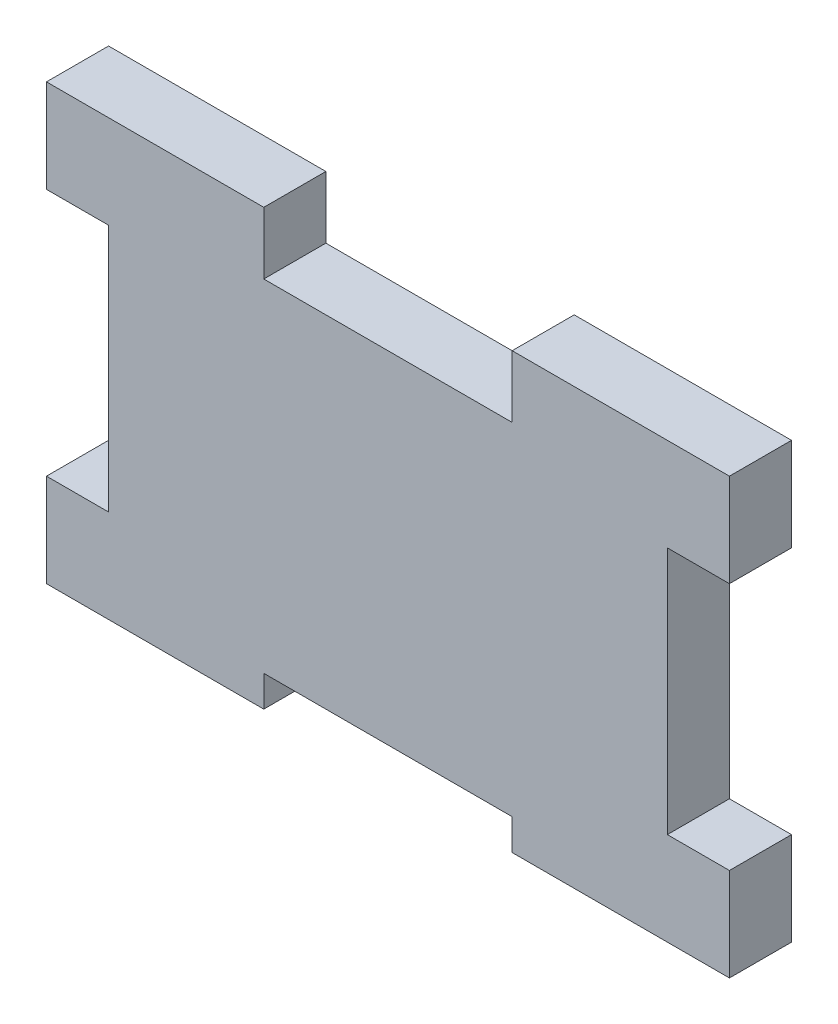
ISO-10303-21;
HEADER;
FILE_DESCRIPTION(('STEP AP214'),'2;1');
FILE_NAME('part.step','',(''),(''),'','','');
FILE_SCHEMA(('AUTOMOTIVE_DESIGN { 1 0 10303 214 1 1 1 1 }'));
ENDSEC;
DATA;
#1=APPLICATION_CONTEXT('core data for automotive mechanical design processes');
#2=APPLICATION_PROTOCOL_DEFINITION('international standard','automotive_design',2000,#1);
#3=PRODUCT_CONTEXT('',#1,'mechanical');
#4=PRODUCT('Part','Part','',(#3));
#5=PRODUCT_RELATED_PRODUCT_CATEGORY('part','',(#4));
#6=PRODUCT_DEFINITION_FORMATION('','',#4);
#7=PRODUCT_DEFINITION_CONTEXT('part definition',#1,'design');
#8=PRODUCT_DEFINITION('design','',#6,#7);
#9=PRODUCT_DEFINITION_SHAPE('','',#8);
#10=(LENGTH_UNIT() NAMED_UNIT(*) SI_UNIT(.MILLI.,.METRE.));
#11=(NAMED_UNIT(*) PLANE_ANGLE_UNIT() SI_UNIT($,.RADIAN.));
#12=(NAMED_UNIT(*) SI_UNIT($,.STERADIAN.) SOLID_ANGLE_UNIT());
#13=UNCERTAINTY_MEASURE_WITH_UNIT(LENGTH_MEASURE(1.E-05),#10,'distance_accuracy_value','');
#14=(GEOMETRIC_REPRESENTATION_CONTEXT(3) GLOBAL_UNCERTAINTY_ASSIGNED_CONTEXT((#13)) GLOBAL_UNIT_ASSIGNED_CONTEXT((#10,
#11,#12)) REPRESENTATION_CONTEXT('',''));
#15=CARTESIAN_POINT('',(0.,0.,0.));
#16=DIRECTION('',(0.,0.,1.));
#17=DIRECTION('',(1.,0.,0.));
#18=AXIS2_PLACEMENT_3D('',#15,#16,#17);
#19=CARTESIAN_POINT('',(25.,0.,10.));
#20=DIRECTION('',(1.,0.,0.));
#21=DIRECTION('',(0.,0.,-1.));
#22=AXIS2_PLACEMENT_3D('',#19,#20,#21);
#23=PLANE('',#22);
#24=DIRECTION('',(0.,-1.,0.));
#25=VECTOR('',#24,1.);
#26=CARTESIAN_POINT('',(25.,0.,0.));
#27=LINE('',#26,#25);
#28=CARTESIAN_POINT('',(25.,0.,0.));
#29=VERTEX_POINT('',#28);
#30=CARTESIAN_POINT('',(25.,-5.,0.));
#31=VERTEX_POINT('',#30);
#32=EDGE_CURVE('E243',#29,#31,#27,.T.);
#33=ORIENTED_EDGE('',*,*,#32,.F.);
#34=DIRECTION('',(0.,0.,-1.));
#35=VECTOR('',#34,1.);
#36=CARTESIAN_POINT('',(25.,0.,10.));
#37=LINE('',#36,#35);
#38=CARTESIAN_POINT('',(25.,0.,10.));
#39=VERTEX_POINT('',#38);
#40=EDGE_CURVE('E11',#39,#29,#37,.T.);
#41=ORIENTED_EDGE('',*,*,#40,.F.);
#42=DIRECTION('',(0.,-1.,0.));
#43=VECTOR('',#42,1.);
#44=CARTESIAN_POINT('',(25.,0.,10.));
#45=LINE('',#44,#43);
#46=CARTESIAN_POINT('',(25.,-5.,10.));
#47=VERTEX_POINT('',#46);
#48=EDGE_CURVE('E315',#39,#47,#45,.T.);
#49=ORIENTED_EDGE('',*,*,#48,.T.);
#50=DIRECTION('',(0.,0.,-1.));
#51=VECTOR('',#50,1.);
#52=CARTESIAN_POINT('',(25.,-5.,10.));
#53=LINE('',#52,#51);
#54=EDGE_CURVE('E58',#47,#31,#53,.T.);
#55=ORIENTED_EDGE('',*,*,#54,.T.);
#56=EDGE_LOOP('',(#33,#41,#49,#55));
#57=FACE_BOUND('',#56,.T.);
#58=ADVANCED_FACE('F41',(#57),#23,.T.);
#59=CARTESIAN_POINT('',(0.,0.,10.));
#60=DIRECTION('',(0.,1.,0.));
#61=DIRECTION('',(0.,0.,1.));
#62=AXIS2_PLACEMENT_3D('',#59,#60,#61);
#63=PLANE('',#62);
#64=DIRECTION('',(1.,0.,0.));
#65=VECTOR('',#64,1.);
#66=CARTESIAN_POINT('',(0.,0.,0.));
#67=LINE('',#66,#65);
#68=CARTESIAN_POINT('',(65.,0.,0.));
#69=VERTEX_POINT('',#68);
#70=EDGE_CURVE('E246',#29,#69,#67,.T.);
#71=ORIENTED_EDGE('',*,*,#70,.T.);
#72=DIRECTION('',(0.,0.,-1.));
#73=VECTOR('',#72,1.);
#74=CARTESIAN_POINT('',(65.,0.,10.));
#75=LINE('',#74,#73);
#76=CARTESIAN_POINT('',(65.,0.,10.));
#77=VERTEX_POINT('',#76);
#78=EDGE_CURVE('E50',#77,#69,#75,.T.);
#79=ORIENTED_EDGE('',*,*,#78,.F.);
#80=DIRECTION('',(1.,0.,0.));
#81=VECTOR('',#80,1.);
#82=CARTESIAN_POINT('',(0.,0.,10.));
#83=LINE('',#82,#81);
#84=EDGE_CURVE('E391',#39,#77,#83,.T.);
#85=ORIENTED_EDGE('',*,*,#84,.F.);
#86=ORIENTED_EDGE('',*,*,#40,.T.);
#87=EDGE_LOOP('',(#71,#79,#85,#86));
#88=FACE_BOUND('',#87,.T.);
#89=ADVANCED_FACE('F449',(#88),#63,.F.);
#90=CARTESIAN_POINT('',(65.,0.,10.));
#91=DIRECTION('',(1.,0.,0.));
#92=DIRECTION('',(0.,0.,-1.));
#93=AXIS2_PLACEMENT_3D('',#90,#91,#92);
#94=PLANE('',#93);
#95=DIRECTION('',(0.,-1.,0.));
#96=VECTOR('',#95,1.);
#97=CARTESIAN_POINT('',(65.,0.,0.));
#98=LINE('',#97,#96);
#99=CARTESIAN_POINT('',(65.,-5.,0.));
#100=VERTEX_POINT('',#99);
#101=EDGE_CURVE('E249',#69,#100,#98,.T.);
#102=ORIENTED_EDGE('',*,*,#101,.T.);
#103=DIRECTION('',(0.,0.,-1.));
#104=VECTOR('',#103,1.);
#105=CARTESIAN_POINT('',(65.,-5.,10.));
#106=LINE('',#105,#104);
#107=CARTESIAN_POINT('',(65.,-5.,10.));
#108=VERTEX_POINT('',#107);
#109=EDGE_CURVE('E360',#108,#100,#106,.T.);
#110=ORIENTED_EDGE('',*,*,#109,.F.);
#111=DIRECTION('',(0.,-1.,0.));
#112=VECTOR('',#111,1.);
#113=CARTESIAN_POINT('',(65.,0.,10.));
#114=LINE('',#113,#112);
#115=EDGE_CURVE('E370',#77,#108,#114,.T.);
#116=ORIENTED_EDGE('',*,*,#115,.F.);
#117=ORIENTED_EDGE('',*,*,#78,.T.);
#118=EDGE_LOOP('',(#102,#110,#116,#117));
#119=FACE_BOUND('',#118,.T.);
#120=ADVANCED_FACE('F368',(#119),#94,.F.);
#121=CARTESIAN_POINT('',(0.,-5.,10.));
#122=DIRECTION('',(0.,-1.,0.));
#123=DIRECTION('',(0.,0.,-1.));
#124=AXIS2_PLACEMENT_3D('',#121,#122,#123);
#125=PLANE('',#124);
#126=DIRECTION('',(-1.,0.,0.));
#127=VECTOR('',#126,1.);
#128=CARTESIAN_POINT('',(0.,-5.,0.));
#129=LINE('',#128,#127);
#130=CARTESIAN_POINT('',(100.,-5.,0.));
#131=VERTEX_POINT('',#130);
#132=EDGE_CURVE('E253',#131,#100,#129,.T.);
#133=ORIENTED_EDGE('',*,*,#132,.F.);
#134=DIRECTION('',(0.,0.,-1.));
#135=VECTOR('',#134,1.);
#136=CARTESIAN_POINT('',(100.,-5.,10.));
#137=LINE('',#136,#135);
#138=CARTESIAN_POINT('',(100.,-5.,10.));
#139=VERTEX_POINT('',#138);
#140=EDGE_CURVE('E357',#139,#131,#137,.T.);
#141=ORIENTED_EDGE('',*,*,#140,.F.);
#142=DIRECTION('',(-1.,0.,0.));
#143=VECTOR('',#142,1.);
#144=CARTESIAN_POINT('',(0.,-5.,10.));
#145=LINE('',#144,#143);
#146=EDGE_CURVE('E381',#139,#108,#145,.T.);
#147=ORIENTED_EDGE('',*,*,#146,.T.);
#148=ORIENTED_EDGE('',*,*,#109,.T.);
#149=EDGE_LOOP('',(#133,#141,#147,#148));
#150=FACE_BOUND('',#149,.T.);
#151=ADVANCED_FACE('F378',(#150),#125,.T.);
#152=CARTESIAN_POINT('',(100.,0.,10.));
#153=DIRECTION('',(1.,0.,0.));
#154=DIRECTION('',(0.,0.,-1.));
#155=AXIS2_PLACEMENT_3D('',#152,#153,#154);
#156=PLANE('',#155);
#157=DIRECTION('',(0.,-1.,0.));
#158=VECTOR('',#157,1.);
#159=CARTESIAN_POINT('',(100.,0.,0.));
#160=LINE('',#159,#158);
#161=CARTESIAN_POINT('',(100.,10.,0.));
#162=VERTEX_POINT('',#161);
#163=EDGE_CURVE('E257',#162,#131,#160,.T.);
#164=ORIENTED_EDGE('',*,*,#163,.F.);
#165=DIRECTION('',(0.,0.,-1.));
#166=VECTOR('',#165,1.);
#167=CARTESIAN_POINT('',(100.,10.,10.));
#168=LINE('',#167,#166);
#169=CARTESIAN_POINT('',(100.,10.,10.));
#170=VERTEX_POINT('',#169);
#171=EDGE_CURVE('E354',#170,#162,#168,.T.);
#172=ORIENTED_EDGE('',*,*,#171,.F.);
#173=DIRECTION('',(0.,-1.,0.));
#174=VECTOR('',#173,1.);
#175=CARTESIAN_POINT('',(100.,0.,10.));
#176=LINE('',#175,#174);
#177=EDGE_CURVE('E385',#170,#139,#176,.T.);
#178=ORIENTED_EDGE('',*,*,#177,.T.);
#179=ORIENTED_EDGE('',*,*,#140,.T.);
#180=EDGE_LOOP('',(#164,#172,#178,#179));
#181=FACE_BOUND('',#180,.T.);
#182=ADVANCED_FACE('F460',(#181),#156,.T.);
#183=CARTESIAN_POINT('',(0.,10.,10.));
#184=DIRECTION('',(0.,1.,0.));
#185=DIRECTION('',(0.,0.,1.));
#186=AXIS2_PLACEMENT_3D('',#183,#184,#185);
#187=PLANE('',#186);
#188=DIRECTION('',(1.,0.,0.));
#189=VECTOR('',#188,1.);
#190=CARTESIAN_POINT('',(0.,10.,0.));
#191=LINE('',#190,#189);
#192=CARTESIAN_POINT('',(90.,10.,0.));
#193=VERTEX_POINT('',#192);
#194=EDGE_CURVE('E261',#193,#162,#191,.T.);
#195=ORIENTED_EDGE('',*,*,#194,.F.);
#196=DIRECTION('',(0.,0.,-1.));
#197=VECTOR('',#196,1.);
#198=CARTESIAN_POINT('',(90.,10.,10.));
#199=LINE('',#198,#197);
#200=CARTESIAN_POINT('',(90.,10.,10.));
#201=VERTEX_POINT('',#200);
#202=EDGE_CURVE('E351',#201,#193,#199,.T.);
#203=ORIENTED_EDGE('',*,*,#202,.F.);
#204=DIRECTION('',(1.,0.,0.));
#205=VECTOR('',#204,1.);
#206=CARTESIAN_POINT('',(0.,10.,10.));
#207=LINE('',#206,#205);
#208=EDGE_CURVE('E388',#201,#170,#207,.T.);
#209=ORIENTED_EDGE('',*,*,#208,.T.);
#210=ORIENTED_EDGE('',*,*,#171,.T.);
#211=EDGE_LOOP('',(#195,#203,#209,#210));
#212=FACE_BOUND('',#211,.T.);
#213=ADVANCED_FACE('F463',(#212),#187,.T.);
#214=CARTESIAN_POINT('',(90.,0.,10.));
#215=DIRECTION('',(-1.,0.,0.));
#216=DIRECTION('',(0.,0.,1.));
#217=AXIS2_PLACEMENT_3D('',#214,#215,#216);
#218=PLANE('',#217);
#219=DIRECTION('',(0.,1.,0.));
#220=VECTOR('',#219,1.);
#221=CARTESIAN_POINT('',(90.,0.,0.));
#222=LINE('',#221,#220);
#223=CARTESIAN_POINT('',(90.,50.,0.));
#224=VERTEX_POINT('',#223);
#225=EDGE_CURVE('E265',#193,#224,#222,.T.);
#226=ORIENTED_EDGE('',*,*,#225,.T.);
#227=DIRECTION('',(0.,0.,-1.));
#228=VECTOR('',#227,1.);
#229=CARTESIAN_POINT('',(90.,50.,10.));
#230=LINE('',#229,#228);
#231=CARTESIAN_POINT('',(90.,50.,10.));
#232=VERTEX_POINT('',#231);
#233=EDGE_CURVE('E348',#232,#224,#230,.T.);
#234=ORIENTED_EDGE('',*,*,#233,.F.);
#235=DIRECTION('',(0.,1.,0.));
#236=VECTOR('',#235,1.);
#237=CARTESIAN_POINT('',(90.,0.,10.));
#238=LINE('',#237,#236);
#239=EDGE_CURVE('E398',#201,#232,#238,.T.);
#240=ORIENTED_EDGE('',*,*,#239,.F.);
#241=ORIENTED_EDGE('',*,*,#202,.T.);
#242=EDGE_LOOP('',(#226,#234,#240,#241));
#243=FACE_BOUND('',#242,.T.);
#244=ADVANCED_FACE('F467',(#243),#218,.F.);
#245=CARTESIAN_POINT('',(0.,50.,10.));
#246=DIRECTION('',(0.,1.,0.));
#247=DIRECTION('',(0.,0.,1.));
#248=AXIS2_PLACEMENT_3D('',#245,#246,#247);
#249=PLANE('',#248);
#250=DIRECTION('',(1.,0.,0.));
#251=VECTOR('',#250,1.);
#252=CARTESIAN_POINT('',(0.,50.,0.));
#253=LINE('',#252,#251);
#254=CARTESIAN_POINT('',(100.,50.,0.));
#255=VERTEX_POINT('',#254);
#256=EDGE_CURVE('E268',#224,#255,#253,.T.);
#257=ORIENTED_EDGE('',*,*,#256,.T.);
#258=DIRECTION('',(0.,0.,-1.));
#259=VECTOR('',#258,1.);
#260=CARTESIAN_POINT('',(100.,50.,10.));
#261=LINE('',#260,#259);
#262=CARTESIAN_POINT('',(100.,50.,10.));
#263=VERTEX_POINT('',#262);
#264=EDGE_CURVE('E346',#263,#255,#261,.T.);
#265=ORIENTED_EDGE('',*,*,#264,.F.);
#266=DIRECTION('',(1.,0.,0.));
#267=VECTOR('',#266,1.);
#268=CARTESIAN_POINT('',(0.,50.,10.));
#269=LINE('',#268,#267);
#270=EDGE_CURVE('E401',#232,#263,#269,.T.);
#271=ORIENTED_EDGE('',*,*,#270,.F.);
#272=ORIENTED_EDGE('',*,*,#233,.T.);
#273=EDGE_LOOP('',(#257,#265,#271,#272));
#274=FACE_BOUND('',#273,.T.);
#275=ADVANCED_FACE('F471',(#274),#249,.F.);
#276=CARTESIAN_POINT('',(99.9999999999999,0.,10.));
#277=DIRECTION('',(1.,0.,0.));
#278=DIRECTION('',(0.,1.,0.));
#279=AXIS2_PLACEMENT_3D('',#276,#277,#278);
#280=PLANE('',#279);
#281=DIRECTION('',(0.,-1.,0.));
#282=VECTOR('',#281,1.);
#283=CARTESIAN_POINT('',(99.9999999999999,0.,0.));
#284=LINE('',#283,#282);
#285=CARTESIAN_POINT('',(100.,65.,0.));
#286=VERTEX_POINT('',#285);
#287=EDGE_CURVE('E271',#286,#255,#284,.T.);
#288=ORIENTED_EDGE('',*,*,#287,.F.);
#289=DIRECTION('',(0.,0.,-1.));
#290=VECTOR('',#289,1.);
#291=CARTESIAN_POINT('',(100.,65.,10.));
#292=LINE('',#291,#290);
#293=CARTESIAN_POINT('',(100.,65.,10.));
#294=VERTEX_POINT('',#293);
#295=EDGE_CURVE('E343',#294,#286,#292,.T.);
#296=ORIENTED_EDGE('',*,*,#295,.F.);
#297=DIRECTION('',(0.,-1.,0.));
#298=VECTOR('',#297,1.);
#299=CARTESIAN_POINT('',(99.9999999999999,0.,10.));
#300=LINE('',#299,#298);
#301=EDGE_CURVE('E403',#294,#263,#300,.T.);
#302=ORIENTED_EDGE('',*,*,#301,.T.);
#303=ORIENTED_EDGE('',*,*,#264,.T.);
#304=EDGE_LOOP('',(#288,#296,#302,#303));
#305=FACE_BOUND('',#304,.T.);
#306=ADVANCED_FACE('F475',(#305),#280,.T.);
#307=CARTESIAN_POINT('',(0.,65.,10.));
#308=DIRECTION('',(0.,1.,0.));
#309=DIRECTION('',(0.,0.,1.));
#310=AXIS2_PLACEMENT_3D('',#307,#308,#309);
#311=PLANE('',#310);
#312=DIRECTION('',(1.,0.,0.));
#313=VECTOR('',#312,1.);
#314=CARTESIAN_POINT('',(0.,65.,0.));
#315=LINE('',#314,#313);
#316=CARTESIAN_POINT('',(65.,65.,0.));
#317=VERTEX_POINT('',#316);
#318=EDGE_CURVE('E275',#317,#286,#315,.T.);
#319=ORIENTED_EDGE('',*,*,#318,.F.);
#320=DIRECTION('',(0.,0.,-1.));
#321=VECTOR('',#320,1.);
#322=CARTESIAN_POINT('',(65.,65.,10.));
#323=LINE('',#322,#321);
#324=CARTESIAN_POINT('',(65.,65.,10.));
#325=VERTEX_POINT('',#324);
#326=EDGE_CURVE('E340',#325,#317,#323,.T.);
#327=ORIENTED_EDGE('',*,*,#326,.F.);
#328=DIRECTION('',(1.,0.,0.));
#329=VECTOR('',#328,1.);
#330=CARTESIAN_POINT('',(0.,65.,10.));
#331=LINE('',#330,#329);
#332=EDGE_CURVE('E407',#325,#294,#331,.T.);
#333=ORIENTED_EDGE('',*,*,#332,.T.);
#334=ORIENTED_EDGE('',*,*,#295,.T.);
#335=EDGE_LOOP('',(#319,#327,#333,#334));
#336=FACE_BOUND('',#335,.T.);
#337=ADVANCED_FACE('F479',(#336),#311,.T.);
#338=CARTESIAN_POINT('',(65.,0.,10.));
#339=DIRECTION('',(-1.,0.,0.));
#340=DIRECTION('',(0.,0.,1.));
#341=AXIS2_PLACEMENT_3D('',#338,#339,#340);
#342=PLANE('',#341);
#343=DIRECTION('',(0.,1.,0.));
#344=VECTOR('',#343,1.);
#345=CARTESIAN_POINT('',(65.,0.,0.));
#346=LINE('',#345,#344);
#347=CARTESIAN_POINT('',(65.,55.,0.));
#348=VERTEX_POINT('',#347);
#349=EDGE_CURVE('E279',#348,#317,#346,.T.);
#350=ORIENTED_EDGE('',*,*,#349,.F.);
#351=DIRECTION('',(0.,0.,-1.));
#352=VECTOR('',#351,1.);
#353=CARTESIAN_POINT('',(65.,55.,10.));
#354=LINE('',#353,#352);
#355=CARTESIAN_POINT('',(65.,55.,10.));
#356=VERTEX_POINT('',#355);
#357=EDGE_CURVE('E337',#356,#348,#354,.T.);
#358=ORIENTED_EDGE('',*,*,#357,.F.);
#359=DIRECTION('',(0.,1.,0.));
#360=VECTOR('',#359,1.);
#361=CARTESIAN_POINT('',(65.,0.,10.));
#362=LINE('',#361,#360);
#363=EDGE_CURVE('E411',#356,#325,#362,.T.);
#364=ORIENTED_EDGE('',*,*,#363,.T.);
#365=ORIENTED_EDGE('',*,*,#326,.T.);
#366=EDGE_LOOP('',(#350,#358,#364,#365));
#367=FACE_BOUND('',#366,.T.);
#368=ADVANCED_FACE('F483',(#367),#342,.T.);
#369=CARTESIAN_POINT('',(0.,55.,10.));
#370=DIRECTION('',(0.,1.,0.));
#371=DIRECTION('',(0.,0.,1.));
#372=AXIS2_PLACEMENT_3D('',#369,#370,#371);
#373=PLANE('',#372);
#374=DIRECTION('',(1.,0.,0.));
#375=VECTOR('',#374,1.);
#376=CARTESIAN_POINT('',(0.,55.,0.));
#377=LINE('',#376,#375);
#378=CARTESIAN_POINT('',(25.,55.,0.));
#379=VERTEX_POINT('',#378);
#380=EDGE_CURVE('E283',#379,#348,#377,.T.);
#381=ORIENTED_EDGE('',*,*,#380,.F.);
#382=DIRECTION('',(0.,0.,-1.));
#383=VECTOR('',#382,1.);
#384=CARTESIAN_POINT('',(25.,55.,10.));
#385=LINE('',#384,#383);
#386=CARTESIAN_POINT('',(25.,55.,10.));
#387=VERTEX_POINT('',#386);
#388=EDGE_CURVE('E334',#387,#379,#385,.T.);
#389=ORIENTED_EDGE('',*,*,#388,.F.);
#390=DIRECTION('',(1.,0.,0.));
#391=VECTOR('',#390,1.);
#392=CARTESIAN_POINT('',(0.,55.,10.));
#393=LINE('',#392,#391);
#394=EDGE_CURVE('E415',#387,#356,#393,.T.);
#395=ORIENTED_EDGE('',*,*,#394,.T.);
#396=ORIENTED_EDGE('',*,*,#357,.T.);
#397=EDGE_LOOP('',(#381,#389,#395,#396));
#398=FACE_BOUND('',#397,.T.);
#399=ADVANCED_FACE('F487',(#398),#373,.T.);
#400=CARTESIAN_POINT('',(25.,0.,10.));
#401=DIRECTION('',(-1.,0.,0.));
#402=DIRECTION('',(0.,0.,1.));
#403=AXIS2_PLACEMENT_3D('',#400,#401,#402);
#404=PLANE('',#403);
#405=DIRECTION('',(0.,1.,0.));
#406=VECTOR('',#405,1.);
#407=CARTESIAN_POINT('',(25.,0.,0.));
#408=LINE('',#407,#406);
#409=CARTESIAN_POINT('',(25.,65.,0.));
#410=VERTEX_POINT('',#409);
#411=EDGE_CURVE('E287',#379,#410,#408,.T.);
#412=ORIENTED_EDGE('',*,*,#411,.T.);
#413=DIRECTION('',(0.,0.,-1.));
#414=VECTOR('',#413,1.);
#415=CARTESIAN_POINT('',(25.,65.,10.));
#416=LINE('',#415,#414);
#417=CARTESIAN_POINT('',(25.,65.,10.));
#418=VERTEX_POINT('',#417);
#419=EDGE_CURVE('E331',#418,#410,#416,.T.);
#420=ORIENTED_EDGE('',*,*,#419,.F.);
#421=DIRECTION('',(0.,1.,0.));
#422=VECTOR('',#421,1.);
#423=CARTESIAN_POINT('',(25.,0.,10.));
#424=LINE('',#423,#422);
#425=EDGE_CURVE('E419',#387,#418,#424,.T.);
#426=ORIENTED_EDGE('',*,*,#425,.F.);
#427=ORIENTED_EDGE('',*,*,#388,.T.);
#428=EDGE_LOOP('',(#412,#420,#426,#427));
#429=FACE_BOUND('',#428,.T.);
#430=ADVANCED_FACE('F491',(#429),#404,.F.);
#431=CARTESIAN_POINT('',(0.,65.,10.));
#432=DIRECTION('',(0.,1.,0.));
#433=DIRECTION('',(0.,0.,1.));
#434=AXIS2_PLACEMENT_3D('',#431,#432,#433);
#435=PLANE('',#434);
#436=DIRECTION('',(1.,0.,0.));
#437=VECTOR('',#436,1.);
#438=CARTESIAN_POINT('',(0.,65.,0.));
#439=LINE('',#438,#437);
#440=CARTESIAN_POINT('',(-10.,65.,0.));
#441=VERTEX_POINT('',#440);
#442=EDGE_CURVE('E291',#441,#410,#439,.T.);
#443=ORIENTED_EDGE('',*,*,#442,.F.);
#444=DIRECTION('',(0.,0.,-1.));
#445=VECTOR('',#444,1.);
#446=CARTESIAN_POINT('',(-10.,65.,10.));
#447=LINE('',#446,#445);
#448=CARTESIAN_POINT('',(-10.,65.,10.));
#449=VERTEX_POINT('',#448);
#450=EDGE_CURVE('E328',#449,#441,#447,.T.);
#451=ORIENTED_EDGE('',*,*,#450,.F.);
#452=DIRECTION('',(1.,0.,0.));
#453=VECTOR('',#452,1.);
#454=CARTESIAN_POINT('',(0.,65.,10.));
#455=LINE('',#454,#453);
#456=EDGE_CURVE('E422',#449,#418,#455,.T.);
#457=ORIENTED_EDGE('',*,*,#456,.T.);
#458=ORIENTED_EDGE('',*,*,#419,.T.);
#459=EDGE_LOOP('',(#443,#451,#457,#458));
#460=FACE_BOUND('',#459,.T.);
#461=ADVANCED_FACE('F495',(#460),#435,.T.);
#462=CARTESIAN_POINT('',(-10.,0.,10.));
#463=DIRECTION('',(-1.,0.,0.));
#464=DIRECTION('',(0.,0.,1.));
#465=AXIS2_PLACEMENT_3D('',#462,#463,#464);
#466=PLANE('',#465);
#467=DIRECTION('',(0.,1.,0.));
#468=VECTOR('',#467,1.);
#469=CARTESIAN_POINT('',(-10.,0.,0.));
#470=LINE('',#469,#468);
#471=CARTESIAN_POINT('',(-10.,50.,0.));
#472=VERTEX_POINT('',#471);
#473=EDGE_CURVE('E295',#472,#441,#470,.T.);
#474=ORIENTED_EDGE('',*,*,#473,.F.);
#475=DIRECTION('',(0.,0.,-1.));
#476=VECTOR('',#475,1.);
#477=CARTESIAN_POINT('',(-10.,50.,10.));
#478=LINE('',#477,#476);
#479=CARTESIAN_POINT('',(-10.,50.,10.));
#480=VERTEX_POINT('',#479);
#481=EDGE_CURVE('E325',#480,#472,#478,.T.);
#482=ORIENTED_EDGE('',*,*,#481,.F.);
#483=DIRECTION('',(0.,1.,0.));
#484=VECTOR('',#483,1.);
#485=CARTESIAN_POINT('',(-10.,0.,10.));
#486=LINE('',#485,#484);
#487=EDGE_CURVE('E426',#480,#449,#486,.T.);
#488=ORIENTED_EDGE('',*,*,#487,.T.);
#489=ORIENTED_EDGE('',*,*,#450,.T.);
#490=EDGE_LOOP('',(#474,#482,#488,#489));
#491=FACE_BOUND('',#490,.T.);
#492=ADVANCED_FACE('F499',(#491),#466,.T.);
#493=CARTESIAN_POINT('',(0.,50.,10.));
#494=DIRECTION('',(0.,-1.,0.));
#495=DIRECTION('',(0.,0.,-1.));
#496=AXIS2_PLACEMENT_3D('',#493,#494,#495);
#497=PLANE('',#496);
#498=DIRECTION('',(-1.,0.,0.));
#499=VECTOR('',#498,1.);
#500=CARTESIAN_POINT('',(0.,50.,0.));
#501=LINE('',#500,#499);
#502=CARTESIAN_POINT('',(0.,50.,0.));
#503=VERTEX_POINT('',#502);
#504=EDGE_CURVE('E299',#503,#472,#501,.T.);
#505=ORIENTED_EDGE('',*,*,#504,.F.);
#506=DIRECTION('',(0.,0.,-1.));
#507=VECTOR('',#506,1.);
#508=CARTESIAN_POINT('',(0.,50.,10.));
#509=LINE('',#508,#507);
#510=CARTESIAN_POINT('',(0.,50.,10.));
#511=VERTEX_POINT('',#510);
#512=EDGE_CURVE('E322',#511,#503,#509,.T.);
#513=ORIENTED_EDGE('',*,*,#512,.F.);
#514=DIRECTION('',(-1.,0.,0.));
#515=VECTOR('',#514,1.);
#516=CARTESIAN_POINT('',(0.,50.,10.));
#517=LINE('',#516,#515);
#518=EDGE_CURVE('E430',#511,#480,#517,.T.);
#519=ORIENTED_EDGE('',*,*,#518,.T.);
#520=ORIENTED_EDGE('',*,*,#481,.T.);
#521=EDGE_LOOP('',(#505,#513,#519,#520));
#522=FACE_BOUND('',#521,.T.);
#523=ADVANCED_FACE('F503',(#522),#497,.T.);
#524=CARTESIAN_POINT('',(0.,0.,10.));
#525=DIRECTION('',(-1.,0.,0.));
#526=DIRECTION('',(0.,0.,1.));
#527=AXIS2_PLACEMENT_3D('',#524,#525,#526);
#528=PLANE('',#527);
#529=DIRECTION('',(0.,1.,0.));
#530=VECTOR('',#529,1.);
#531=CARTESIAN_POINT('',(0.,0.,0.));
#532=LINE('',#531,#530);
#533=CARTESIAN_POINT('',(0.,10.,0.));
#534=VERTEX_POINT('',#533);
#535=EDGE_CURVE('E303',#534,#503,#532,.T.);
#536=ORIENTED_EDGE('',*,*,#535,.F.);
#537=DIRECTION('',(0.,0.,-1.));
#538=VECTOR('',#537,1.);
#539=CARTESIAN_POINT('',(0.,10.,10.));
#540=LINE('',#539,#538);
#541=CARTESIAN_POINT('',(0.,10.,10.));
#542=VERTEX_POINT('',#541);
#543=EDGE_CURVE('E232',#542,#534,#540,.T.);
#544=ORIENTED_EDGE('',*,*,#543,.F.);
#545=DIRECTION('',(0.,1.,0.));
#546=VECTOR('',#545,1.);
#547=CARTESIAN_POINT('',(0.,0.,10.));
#548=LINE('',#547,#546);
#549=EDGE_CURVE('E220',#542,#511,#548,.T.);
#550=ORIENTED_EDGE('',*,*,#549,.T.);
#551=ORIENTED_EDGE('',*,*,#512,.T.);
#552=EDGE_LOOP('',(#536,#544,#550,#551));
#553=FACE_BOUND('',#552,.T.);
#554=ADVANCED_FACE('F436',(#553),#528,.T.);
#555=CARTESIAN_POINT('',(0.,10.,10.));
#556=DIRECTION('',(0.,-1.,0.));
#557=DIRECTION('',(0.,0.,-1.));
#558=AXIS2_PLACEMENT_3D('',#555,#556,#557);
#559=PLANE('',#558);
#560=DIRECTION('',(-1.,0.,0.));
#561=VECTOR('',#560,1.);
#562=CARTESIAN_POINT('',(0.,10.,0.));
#563=LINE('',#562,#561);
#564=CARTESIAN_POINT('',(-9.99999999999999,10.,0.));
#565=VERTEX_POINT('',#564);
#566=EDGE_CURVE('E228',#534,#565,#563,.T.);
#567=ORIENTED_EDGE('',*,*,#566,.T.);
#568=DIRECTION('',(0.,0.,-1.));
#569=VECTOR('',#568,1.);
#570=CARTESIAN_POINT('',(-9.99999999999999,10.,10.));
#571=LINE('',#570,#569);
#572=CARTESIAN_POINT('',(-9.99999999999999,10.,10.));
#573=VERTEX_POINT('',#572);
#574=EDGE_CURVE('E225',#573,#565,#571,.T.);
#575=ORIENTED_EDGE('',*,*,#574,.F.);
#576=DIRECTION('',(-1.,0.,0.));
#577=VECTOR('',#576,1.);
#578=CARTESIAN_POINT('',(0.,10.,10.));
#579=LINE('',#578,#577);
#580=EDGE_CURVE('E211',#542,#573,#579,.T.);
#581=ORIENTED_EDGE('',*,*,#580,.F.);
#582=ORIENTED_EDGE('',*,*,#543,.T.);
#583=EDGE_LOOP('',(#567,#575,#581,#582));
#584=FACE_BOUND('',#583,.T.);
#585=ADVANCED_FACE('F226',(#584),#559,.F.);
#586=CARTESIAN_POINT('',(-10.,0.,10.));
#587=DIRECTION('',(-1.,0.,0.));
#588=DIRECTION('',(0.,-1.,0.));
#589=AXIS2_PLACEMENT_3D('',#586,#587,#588);
#590=PLANE('',#589);
#591=DIRECTION('',(0.,1.,0.));
#592=VECTOR('',#591,1.);
#593=CARTESIAN_POINT('',(-10.,0.,0.));
#594=LINE('',#593,#592);
#595=CARTESIAN_POINT('',(-10.,-5.,0.));
#596=VERTEX_POINT('',#595);
#597=EDGE_CURVE('E308',#596,#565,#594,.T.);
#598=ORIENTED_EDGE('',*,*,#597,.F.);
#599=DIRECTION('',(0.,0.,-1.));
#600=VECTOR('',#599,1.);
#601=CARTESIAN_POINT('',(-10.,-5.,10.));
#602=LINE('',#601,#600);
#603=CARTESIAN_POINT('',(-10.,-5.,10.));
#604=VERTEX_POINT('',#603);
#605=EDGE_CURVE('E135',#604,#596,#602,.T.);
#606=ORIENTED_EDGE('',*,*,#605,.F.);
#607=DIRECTION('',(0.,1.,0.));
#608=VECTOR('',#607,1.);
#609=CARTESIAN_POINT('',(-10.,0.,10.));
#610=LINE('',#609,#608);
#611=EDGE_CURVE('E217',#604,#573,#610,.T.);
#612=ORIENTED_EDGE('',*,*,#611,.T.);
#613=ORIENTED_EDGE('',*,*,#574,.T.);
#614=EDGE_LOOP('',(#598,#606,#612,#613));
#615=FACE_BOUND('',#614,.T.);
#616=ADVANCED_FACE('F234',(#615),#590,.T.);
#617=CARTESIAN_POINT('',(0.,-5.,10.));
#618=DIRECTION('',(0.,-1.,0.));
#619=DIRECTION('',(0.,0.,-1.));
#620=AXIS2_PLACEMENT_3D('',#617,#618,#619);
#621=PLANE('',#620);
#622=DIRECTION('',(-1.,0.,0.));
#623=VECTOR('',#622,1.);
#624=CARTESIAN_POINT('',(0.,-5.,0.));
#625=LINE('',#624,#623);
#626=EDGE_CURVE('E311',#31,#596,#625,.T.);
#627=ORIENTED_EDGE('',*,*,#626,.F.);
#628=ORIENTED_EDGE('',*,*,#54,.F.);
#629=DIRECTION('',(-1.,0.,0.));
#630=VECTOR('',#629,1.);
#631=CARTESIAN_POINT('',(0.,-5.,10.));
#632=LINE('',#631,#630);
#633=EDGE_CURVE('E236',#47,#604,#632,.T.);
#634=ORIENTED_EDGE('',*,*,#633,.T.);
#635=ORIENTED_EDGE('',*,*,#605,.T.);
#636=EDGE_LOOP('',(#627,#628,#634,#635));
#637=FACE_BOUND('',#636,.T.);
#638=ADVANCED_FACE('F438',(#637),#621,.T.);
#639=CARTESIAN_POINT('',(0.,0.,10.));
#640=DIRECTION('',(0.,0.,1.));
#641=DIRECTION('',(1.,0.,0.));
#642=AXIS2_PLACEMENT_3D('',#639,#640,#641);
#643=PLANE('',#642);
#644=ORIENTED_EDGE('',*,*,#48,.F.);
#645=ORIENTED_EDGE('',*,*,#84,.T.);
#646=ORIENTED_EDGE('',*,*,#115,.T.);
#647=ORIENTED_EDGE('',*,*,#146,.F.);
#648=ORIENTED_EDGE('',*,*,#177,.F.);
#649=ORIENTED_EDGE('',*,*,#208,.F.);
#650=ORIENTED_EDGE('',*,*,#239,.T.);
#651=ORIENTED_EDGE('',*,*,#270,.T.);
#652=ORIENTED_EDGE('',*,*,#301,.F.);
#653=ORIENTED_EDGE('',*,*,#332,.F.);
#654=ORIENTED_EDGE('',*,*,#363,.F.);
#655=ORIENTED_EDGE('',*,*,#394,.F.);
#656=ORIENTED_EDGE('',*,*,#425,.T.);
#657=ORIENTED_EDGE('',*,*,#456,.F.);
#658=ORIENTED_EDGE('',*,*,#487,.F.);
#659=ORIENTED_EDGE('',*,*,#518,.F.);
#660=ORIENTED_EDGE('',*,*,#549,.F.);
#661=ORIENTED_EDGE('',*,*,#580,.T.);
#662=ORIENTED_EDGE('',*,*,#611,.F.);
#663=ORIENTED_EDGE('',*,*,#633,.F.);
#664=EDGE_LOOP('',(#644,#645,#646,#647,#648,#649,#650,#651,#652,#653,#654,#655,#656,#657,#658,
#659,#660,#661,#662,#663));
#665=FACE_BOUND('',#664,.T.);
#666=ADVANCED_FACE('F214',(#665),#643,.T.);
#667=CARTESIAN_POINT('',(0.,0.,0.));
#668=DIRECTION('',(0.,0.,1.));
#669=DIRECTION('',(1.,0.,0.));
#670=AXIS2_PLACEMENT_3D('',#667,#668,#669);
#671=PLANE('',#670);
#672=ORIENTED_EDGE('',*,*,#32,.T.);
#673=ORIENTED_EDGE('',*,*,#626,.T.);
#674=ORIENTED_EDGE('',*,*,#597,.T.);
#675=ORIENTED_EDGE('',*,*,#566,.F.);
#676=ORIENTED_EDGE('',*,*,#535,.T.);
#677=ORIENTED_EDGE('',*,*,#504,.T.);
#678=ORIENTED_EDGE('',*,*,#473,.T.);
#679=ORIENTED_EDGE('',*,*,#442,.T.);
#680=ORIENTED_EDGE('',*,*,#411,.F.);
#681=ORIENTED_EDGE('',*,*,#380,.T.);
#682=ORIENTED_EDGE('',*,*,#349,.T.);
#683=ORIENTED_EDGE('',*,*,#318,.T.);
#684=ORIENTED_EDGE('',*,*,#287,.T.);
#685=ORIENTED_EDGE('',*,*,#256,.F.);
#686=ORIENTED_EDGE('',*,*,#225,.F.);
#687=ORIENTED_EDGE('',*,*,#194,.T.);
#688=ORIENTED_EDGE('',*,*,#163,.T.);
#689=ORIENTED_EDGE('',*,*,#132,.T.);
#690=ORIENTED_EDGE('',*,*,#101,.F.);
#691=ORIENTED_EDGE('',*,*,#70,.F.);
#692=EDGE_LOOP('',(#672,#673,#674,#675,#676,#677,#678,#679,#680,#681,#682,#683,#684,#685,#686,
#687,#688,#689,#690,#691));
#693=FACE_BOUND('',#692,.T.);
#694=ADVANCED_FACE('F374',(#693),#671,.F.);
#695=CLOSED_SHELL('',(#58,#89,#120,#151,#182,#213,#244,#275,#306,#337,#368,#399,#430,#461,#492,
#523,#554,#585,#616,#638,#666,#694));
#696=MANIFOLD_SOLID_BREP('B2',#695);
#697=ADVANCED_BREP_SHAPE_REPRESENTATION('',(#18,#696),#14);
#698=SHAPE_DEFINITION_REPRESENTATION(#9,#697);
ENDSEC;
END-ISO-10303-21;
